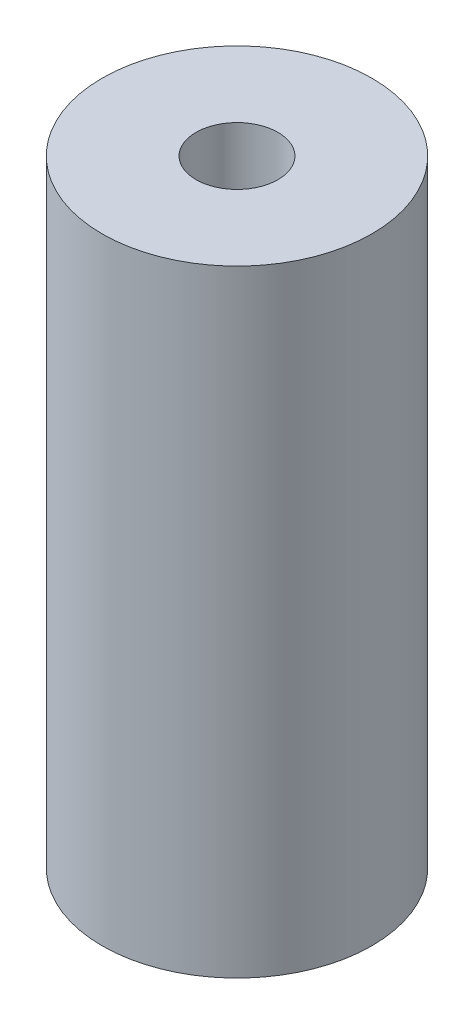
ISO-10303-21;
HEADER;
FILE_DESCRIPTION(('STEP AP214'),'2;1');
FILE_NAME('part.step','',(''),(''),'','','');
FILE_SCHEMA(('AUTOMOTIVE_DESIGN { 1 0 10303 214 1 1 1 1 }'));
ENDSEC;
DATA;
#1=APPLICATION_CONTEXT('core data for automotive mechanical design processes');
#2=APPLICATION_PROTOCOL_DEFINITION('international standard','automotive_design',2000,#1);
#3=PRODUCT_CONTEXT('',#1,'mechanical');
#4=PRODUCT('Part','Part','',(#3));
#5=PRODUCT_RELATED_PRODUCT_CATEGORY('part','',(#4));
#6=PRODUCT_DEFINITION_FORMATION('','',#4);
#7=PRODUCT_DEFINITION_CONTEXT('part definition',#1,'design');
#8=PRODUCT_DEFINITION('design','',#6,#7);
#9=PRODUCT_DEFINITION_SHAPE('','',#8);
#10=(LENGTH_UNIT() NAMED_UNIT(*) SI_UNIT(.MILLI.,.METRE.));
#11=(NAMED_UNIT(*) PLANE_ANGLE_UNIT() SI_UNIT($,.RADIAN.));
#12=(NAMED_UNIT(*) SI_UNIT($,.STERADIAN.) SOLID_ANGLE_UNIT());
#13=UNCERTAINTY_MEASURE_WITH_UNIT(LENGTH_MEASURE(1.E-05),#10,'distance_accuracy_value','');
#14=(GEOMETRIC_REPRESENTATION_CONTEXT(3) GLOBAL_UNCERTAINTY_ASSIGNED_CONTEXT((#13)) GLOBAL_UNIT_ASSIGNED_CONTEXT((#10,
#11,#12)) REPRESENTATION_CONTEXT('',''));
#15=CARTESIAN_POINT('',(0.,0.,0.));
#16=DIRECTION('',(0.,0.,1.));
#17=DIRECTION('',(1.,0.,0.));
#18=AXIS2_PLACEMENT_3D('',#15,#16,#17);
#19=CARTESIAN_POINT('',(0.,50.8,0.));
#20=DIRECTION('',(0.,1.,0.));
#21=DIRECTION('',(0.,0.,1.));
#22=AXIS2_PLACEMENT_3D('',#19,#20,#21);
#23=PLANE('',#22);
#24=CARTESIAN_POINT('',(0.,50.8,0.));
#25=DIRECTION('',(0.,1.,0.));
#26=DIRECTION('',(0.,0.,1.));
#27=AXIS2_PLACEMENT_3D('',#24,#25,#26);
#28=CIRCLE('',#27,11.1125);
#29=CARTESIAN_POINT('',(0.,50.8,11.1125));
#30=VERTEX_POINT('',#29);
#31=EDGE_CURVE('E10',#30,#30,#28,.T.);
#32=ORIENTED_EDGE('',*,*,#31,.T.);
#33=EDGE_LOOP('',(#32));
#34=FACE_BOUND('',#33,.T.);
#35=CARTESIAN_POINT('',(0.,50.8,0.));
#36=DIRECTION('',(0.,1.,0.));
#37=DIRECTION('',(0.,0.,1.));
#38=AXIS2_PLACEMENT_3D('',#35,#36,#37);
#39=CIRCLE('',#38,3.3782);
#40=CARTESIAN_POINT('',(0.,50.8,3.3782));
#41=VERTEX_POINT('',#40);
#42=EDGE_CURVE('E42',#41,#41,#39,.T.);
#43=ORIENTED_EDGE('',*,*,#42,.F.);
#44=EDGE_LOOP('',(#43));
#45=FACE_BOUND('',#44,.T.);
#46=ADVANCED_FACE('F31',(#34,#45),#23,.T.);
#47=CARTESIAN_POINT('',(0.,0.,0.));
#48=DIRECTION('',(0.,1.,0.));
#49=DIRECTION('',(0.,0.,1.));
#50=AXIS2_PLACEMENT_3D('',#47,#48,#49);
#51=PLANE('',#50);
#52=CARTESIAN_POINT('',(0.,0.,0.));
#53=DIRECTION('',(0.,1.,0.));
#54=DIRECTION('',(0.,0.,1.));
#55=AXIS2_PLACEMENT_3D('',#52,#53,#54);
#56=CIRCLE('',#55,11.1125);
#57=CARTESIAN_POINT('',(0.,0.,11.1125));
#58=VERTEX_POINT('',#57);
#59=EDGE_CURVE('E35',#58,#58,#56,.T.);
#60=ORIENTED_EDGE('',*,*,#59,.F.);
#61=EDGE_LOOP('',(#60));
#62=FACE_BOUND('',#61,.T.);
#63=CARTESIAN_POINT('',(0.,0.,0.));
#64=DIRECTION('',(0.,1.,0.));
#65=DIRECTION('',(0.,0.,1.));
#66=AXIS2_PLACEMENT_3D('',#63,#64,#65);
#67=CIRCLE('',#66,3.3782);
#68=CARTESIAN_POINT('',(0.,0.,3.3782));
#69=VERTEX_POINT('',#68);
#70=EDGE_CURVE('E44',#69,#69,#67,.T.);
#71=ORIENTED_EDGE('',*,*,#70,.T.);
#72=EDGE_LOOP('',(#71));
#73=FACE_BOUND('',#72,.T.);
#74=ADVANCED_FACE('F54',(#62,#73),#51,.F.);
#75=CARTESIAN_POINT('',(0.,50.8,0.));
#76=DIRECTION('',(0.,-1.,0.));
#77=DIRECTION('',(0.,0.,-1.));
#78=AXIS2_PLACEMENT_3D('',#75,#76,#77);
#79=CYLINDRICAL_SURFACE('',#78,11.1125);
#80=ORIENTED_EDGE('',*,*,#31,.F.);
#81=EDGE_LOOP('',(#80));
#82=FACE_BOUND('',#81,.T.);
#83=ORIENTED_EDGE('',*,*,#59,.T.);
#84=EDGE_LOOP('',(#83));
#85=FACE_BOUND('',#84,.T.);
#86=ADVANCED_FACE('F33',(#82,#85),#79,.T.);
#87=CARTESIAN_POINT('',(0.,50.8,0.));
#88=DIRECTION('',(0.,-1.,0.));
#89=DIRECTION('',(0.,0.,-1.));
#90=AXIS2_PLACEMENT_3D('',#87,#88,#89);
#91=CYLINDRICAL_SURFACE('',#90,3.3782);
#92=ORIENTED_EDGE('',*,*,#42,.T.);
#93=EDGE_LOOP('',(#92));
#94=FACE_BOUND('',#93,.T.);
#95=ORIENTED_EDGE('',*,*,#70,.F.);
#96=EDGE_LOOP('',(#95));
#97=FACE_BOUND('',#96,.T.);
#98=ADVANCED_FACE('F50',(#94,#97),#91,.F.);
#99=CLOSED_SHELL('',(#46,#74,#86,#98));
#100=MANIFOLD_SOLID_BREP('B2',#99);
#101=ADVANCED_BREP_SHAPE_REPRESENTATION('',(#18,#100),#14);
#102=SHAPE_DEFINITION_REPRESENTATION(#9,#101);
ENDSEC;
END-ISO-10303-21;
